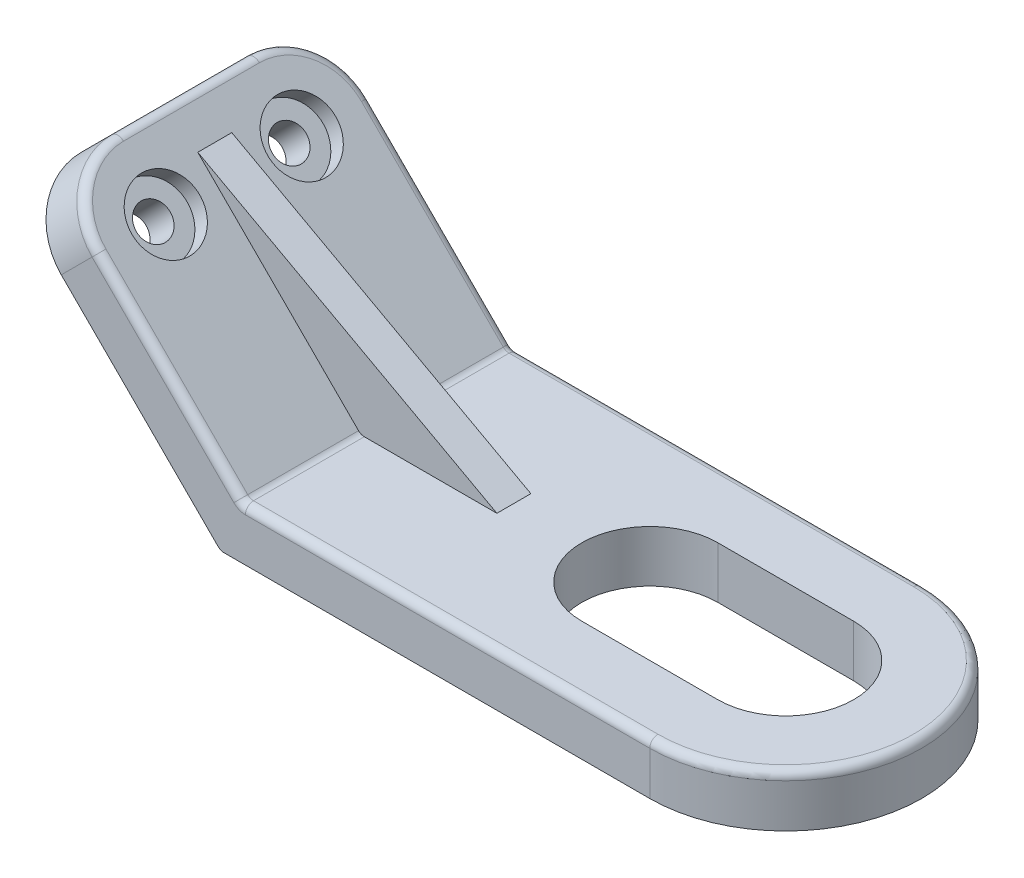
ISO-10303-21;
HEADER;
FILE_DESCRIPTION(('STEP AP214'),'2;1');
FILE_NAME('part.step','',(''),(''),'','','');
FILE_SCHEMA(('AUTOMOTIVE_DESIGN { 1 0 10303 214 1 1 1 1 }'));
ENDSEC;
DATA;
#1=APPLICATION_CONTEXT('core data for automotive mechanical design processes');
#2=APPLICATION_PROTOCOL_DEFINITION('international standard','automotive_design',2000,#1);
#3=PRODUCT_CONTEXT('',#1,'mechanical');
#4=PRODUCT('Part','Part','',(#3));
#5=PRODUCT_RELATED_PRODUCT_CATEGORY('part','',(#4));
#6=PRODUCT_DEFINITION_FORMATION('','',#4);
#7=PRODUCT_DEFINITION_CONTEXT('part definition',#1,'design');
#8=PRODUCT_DEFINITION('design','',#6,#7);
#9=PRODUCT_DEFINITION_SHAPE('','',#8);
#10=(LENGTH_UNIT() NAMED_UNIT(*) SI_UNIT(.MILLI.,.METRE.));
#11=(NAMED_UNIT(*) PLANE_ANGLE_UNIT() SI_UNIT($,.RADIAN.));
#12=(NAMED_UNIT(*) SI_UNIT($,.STERADIAN.) SOLID_ANGLE_UNIT());
#13=UNCERTAINTY_MEASURE_WITH_UNIT(LENGTH_MEASURE(1.E-05),#10,'distance_accuracy_value','');
#14=(GEOMETRIC_REPRESENTATION_CONTEXT(3) GLOBAL_UNCERTAINTY_ASSIGNED_CONTEXT((#13)) GLOBAL_UNIT_ASSIGNED_CONTEXT((#10,
#11,#12)) REPRESENTATION_CONTEXT('',''));
#15=CARTESIAN_POINT('',(0.,0.,0.));
#16=DIRECTION('',(0.,0.,1.));
#17=DIRECTION('',(1.,0.,0.));
#18=AXIS2_PLACEMENT_3D('',#15,#16,#17);
#19=CARTESIAN_POINT('',(76.2,-9.65200000000001,0.));
#20=DIRECTION('',(0.,-1.,0.));
#21=DIRECTION('',(0.,0.,-1.));
#22=AXIS2_PLACEMENT_3D('',#19,#20,#21);
#23=CYLINDRICAL_SURFACE('',#22,25.4);
#24=DIRECTION('',(0.,-1.,0.));
#25=VECTOR('',#24,1.);
#26=CARTESIAN_POINT('',(76.2,0.,-25.4));
#27=LINE('',#26,#25);
#28=CARTESIAN_POINT('',(76.2,-1.524,-25.4));
#29=VERTEX_POINT('',#28);
#30=CARTESIAN_POINT('',(76.2,-9.65200000000001,-25.4));
#31=VERTEX_POINT('',#30);
#32=EDGE_CURVE('E341',#29,#31,#27,.T.);
#33=ORIENTED_EDGE('',*,*,#32,.F.);
#34=CARTESIAN_POINT('',(76.2,-1.524,0.));
#35=DIRECTION('',(0.,-1.,0.));
#36=DIRECTION('',(0.,0.,-1.));
#37=AXIS2_PLACEMENT_3D('',#34,#35,#36);
#38=CIRCLE('',#37,25.4);
#39=CARTESIAN_POINT('',(76.2,-1.524,25.4));
#40=VERTEX_POINT('',#39);
#41=EDGE_CURVE('E370',#29,#40,#38,.T.);
#42=ORIENTED_EDGE('',*,*,#41,.T.);
#43=DIRECTION('',(0.,1.,0.));
#44=VECTOR('',#43,1.);
#45=CARTESIAN_POINT('',(76.2,-9.65200000000002,25.4));
#46=LINE('',#45,#44);
#47=CARTESIAN_POINT('',(76.2,-9.65200000000002,25.4));
#48=VERTEX_POINT('',#47);
#49=EDGE_CURVE('E337',#48,#40,#46,.T.);
#50=ORIENTED_EDGE('',*,*,#49,.F.);
#51=CARTESIAN_POINT('',(76.2,-9.65200000000001,0.));
#52=DIRECTION('',(0.,-1.,0.));
#53=DIRECTION('',(0.,0.,-1.));
#54=AXIS2_PLACEMENT_3D('',#51,#52,#53);
#55=CIRCLE('',#54,25.4);
#56=EDGE_CURVE('E344',#31,#48,#55,.T.);
#57=ORIENTED_EDGE('',*,*,#56,.F.);
#58=EDGE_LOOP('',(#33,#42,#50,#57));
#59=FACE_BOUND('',#58,.T.);
#60=ADVANCED_FACE('F43',(#59),#23,.T.);
#61=CARTESIAN_POINT('',(0.,0.,25.4));
#62=DIRECTION('',(-0.707106781186544,-0.707106781186551,0.));
#63=DIRECTION('',(0.707106781186551,-0.707106781186544,0.));
#64=AXIS2_PLACEMENT_3D('',#61,#62,#63);
#65=PLANE('',#64);
#66=CARTESIAN_POINT('',(-26.9407683632076,26.9407683632073,-12.7));
#67=DIRECTION('',(0.707106781186544,0.707106781186551,0.));
#68=DIRECTION('',(-0.707106781186551,0.707106781186544,0.));
#69=AXIS2_PLACEMENT_3D('',#66,#67,#68);
#70=CIRCLE('',#69,6.35);
#71=CARTESIAN_POINT('',(-31.4308964237422,31.4308964237419,-12.7));
#72=VERTEX_POINT('',#71);
#73=EDGE_CURVE('E479',#72,#72,#70,.T.);
#74=ORIENTED_EDGE('',*,*,#73,.F.);
#75=EDGE_LOOP('',(#74));
#76=FACE_BOUND('',#75,.T.);
#77=CARTESIAN_POINT('',(-26.9407683632076,26.9407683632073,12.7));
#78=DIRECTION('',(0.707106781186544,0.707106781186551,0.));
#79=DIRECTION('',(-0.707106781186551,0.707106781186544,0.));
#80=AXIS2_PLACEMENT_3D('',#77,#78,#79);
#81=CIRCLE('',#80,6.35);
#82=CARTESIAN_POINT('',(-31.4308964237422,31.4308964237419,12.7));
#83=VERTEX_POINT('',#82);
#84=EDGE_CURVE('E282',#83,#83,#81,.T.);
#85=ORIENTED_EDGE('',*,*,#84,.F.);
#86=EDGE_LOOP('',(#85));
#87=FACE_BOUND('',#86,.T.);
#88=DIRECTION('',(0.,0.,-1.));
#89=VECTOR('',#88,1.);
#90=CARTESIAN_POINT('',(-0.446369265471702,0.446369265471694,-25.4));
#91=LINE('',#90,#89);
#92=CARTESIAN_POINT('',(-0.446369265471699,0.446369265471697,-3.175));
#93=VERTEX_POINT('',#92);
#94=CARTESIAN_POINT('',(-0.446369265471702,0.446369265471694,-23.876));
#95=VERTEX_POINT('',#94);
#96=EDGE_CURVE('E320',#93,#95,#91,.T.);
#97=ORIENTED_EDGE('',*,*,#96,.T.);
#98=DIRECTION('',(-0.707106781186551,0.707106781186544,0.));
#99=VECTOR('',#98,1.);
#100=CARTESIAN_POINT('',(-26.9407683632076,26.9407683632073,-23.876));
#101=LINE('',#100,#99);
#102=CARTESIAN_POINT('',(-26.9407683632076,26.9407683632073,-23.876));
#103=VERTEX_POINT('',#102);
#104=EDGE_CURVE('E397',#95,#103,#101,.T.);
#105=ORIENTED_EDGE('',*,*,#104,.T.);
#106=CARTESIAN_POINT('',(-26.9407683632076,26.9407683632073,-12.7));
#107=DIRECTION('',(-0.707106781186544,-0.707106781186551,0.));
#108=DIRECTION('',(0.707106781186551,-0.707106781186544,0.));
#109=AXIS2_PLACEMENT_3D('',#106,#107,#108);
#110=CIRCLE('',#109,11.176);
#111=CARTESIAN_POINT('',(-34.8433937497485,34.8433937497481,-12.7));
#112=VERTEX_POINT('',#111);
#113=EDGE_CURVE('E394',#103,#112,#110,.F.);
#114=ORIENTED_EDGE('',*,*,#113,.T.);
#115=DIRECTION('',(0.,0.,-1.));
#116=VECTOR('',#115,1.);
#117=CARTESIAN_POINT('',(-34.8433937497485,34.8433937497481,12.7));
#118=LINE('',#117,#116);
#119=CARTESIAN_POINT('',(-34.8433937497485,34.8433937497481,12.7));
#120=VERTEX_POINT('',#119);
#121=EDGE_CURVE('E391',#112,#120,#118,.F.);
#122=ORIENTED_EDGE('',*,*,#121,.T.);
#123=CARTESIAN_POINT('',(-26.9407683632076,26.9407683632073,12.7));
#124=DIRECTION('',(-0.707106781186544,-0.707106781186551,0.));
#125=DIRECTION('',(0.707106781186551,-0.707106781186544,0.));
#126=AXIS2_PLACEMENT_3D('',#123,#124,#125);
#127=CIRCLE('',#126,11.176);
#128=CARTESIAN_POINT('',(-26.9407683632076,26.9407683632073,23.876));
#129=VERTEX_POINT('',#128);
#130=EDGE_CURVE('E388',#120,#129,#127,.F.);
#131=ORIENTED_EDGE('',*,*,#130,.T.);
#132=DIRECTION('',(-0.707106781186551,0.707106781186544,0.));
#133=VECTOR('',#132,1.);
#134=CARTESIAN_POINT('',(0.,0.,23.876));
#135=LINE('',#134,#133);
#136=CARTESIAN_POINT('',(-0.446369265471699,0.446369265471694,23.876));
#137=VERTEX_POINT('',#136);
#138=EDGE_CURVE('E385',#129,#137,#135,.F.);
#139=ORIENTED_EDGE('',*,*,#138,.T.);
#140=DIRECTION('',(0.,0.,-1.));
#141=VECTOR('',#140,1.);
#142=CARTESIAN_POINT('',(-0.446369265471699,0.446369265471697,3.175));
#143=LINE('',#142,#141);
#144=CARTESIAN_POINT('',(-0.446369265471699,0.446369265471697,3.175));
#145=VERTEX_POINT('',#144);
#146=EDGE_CURVE('E317',#137,#145,#143,.T.);
#147=ORIENTED_EDGE('',*,*,#146,.T.);
#148=DIRECTION('',(-0.707106781186551,0.707106781186544,0.));
#149=VECTOR('',#148,1.);
#150=CARTESIAN_POINT('',(0.,0.,3.175));
#151=LINE('',#150,#149);
#152=CARTESIAN_POINT('',(-30.4800000000007,30.4800000000004,3.175));
#153=VERTEX_POINT('',#152);
#154=EDGE_CURVE('E469',#145,#153,#151,.T.);
#155=ORIENTED_EDGE('',*,*,#154,.T.);
#156=DIRECTION('',(0.,0.,1.));
#157=VECTOR('',#156,1.);
#158=CARTESIAN_POINT('',(-30.4800000000007,30.4800000000004,25.4));
#159=LINE('',#158,#157);
#160=CARTESIAN_POINT('',(-30.4800000000008,30.4800000000005,-3.175));
#161=VERTEX_POINT('',#160);
#162=EDGE_CURVE('E475',#153,#161,#159,.F.);
#163=ORIENTED_EDGE('',*,*,#162,.T.);
#164=DIRECTION('',(-0.707106781186551,0.707106781186544,0.));
#165=VECTOR('',#164,1.);
#166=CARTESIAN_POINT('',(0.,0.,-3.175));
#167=LINE('',#166,#165);
#168=EDGE_CURVE('E462',#93,#161,#167,.T.);
#169=ORIENTED_EDGE('',*,*,#168,.F.);
#170=EDGE_LOOP('',(#97,#105,#114,#122,#131,#139,#147,#155,#163,#169));
#171=FACE_BOUND('',#170,.T.);
#172=ADVANCED_FACE('F515',(#76,#87,#171),#65,.F.);
#173=CARTESIAN_POINT('',(-42.7460191362893,29.0960298322638,25.4));
#174=DIRECTION('',(-0.707106781186551,0.707106781186545,0.));
#175=DIRECTION('',(-0.707106781186545,-0.707106781186551,0.));
#176=AXIS2_PLACEMENT_3D('',#173,#174,#175);
#177=PLANE('',#176);
#178=DIRECTION('',(0.707106781186545,0.707106781186551,0.));
#179=VECTOR('',#178,1.);
#180=CARTESIAN_POINT('',(-35.9210244842768,35.9210244842764,12.7));
#181=LINE('',#180,#179);
#182=CARTESIAN_POINT('',(-42.7460191362893,29.0960298322638,12.7));
#183=VERTEX_POINT('',#182);
#184=CARTESIAN_POINT('',(-36.9986552188051,34.8433937497481,12.7));
#185=VERTEX_POINT('',#184);
#186=EDGE_CURVE('E287',#183,#185,#181,.T.);
#187=ORIENTED_EDGE('',*,*,#186,.T.);
#188=DIRECTION('',(0.,0.,-1.));
#189=VECTOR('',#188,1.);
#190=CARTESIAN_POINT('',(-36.9986552188051,34.8433937497481,-12.7));
#191=LINE('',#190,#189);
#192=CARTESIAN_POINT('',(-36.9986552188051,34.8433937497481,-12.7));
#193=VERTEX_POINT('',#192);
#194=EDGE_CURVE('E53',#185,#193,#191,.T.);
#195=ORIENTED_EDGE('',*,*,#194,.T.);
#196=DIRECTION('',(0.707106781186545,0.707106781186551,0.));
#197=VECTOR('',#196,1.);
#198=CARTESIAN_POINT('',(-42.7460191362893,29.0960298322638,-12.7));
#199=LINE('',#198,#197);
#200=CARTESIAN_POINT('',(-42.7460191362893,29.0960298322638,-12.7));
#201=VERTEX_POINT('',#200);
#202=EDGE_CURVE('E290',#193,#201,#199,.F.);
#203=ORIENTED_EDGE('',*,*,#202,.T.);
#204=DIRECTION('',(0.,0.,-1.));
#205=VECTOR('',#204,1.);
#206=CARTESIAN_POINT('',(-42.7460191362893,29.0960298322638,25.4));
#207=LINE('',#206,#205);
#208=EDGE_CURVE('E265',#183,#201,#207,.T.);
#209=ORIENTED_EDGE('',*,*,#208,.F.);
#210=EDGE_LOOP('',(#187,#195,#203,#209));
#211=FACE_BOUND('',#210,.T.);
#212=ADVANCED_FACE('F518',(#211),#177,.T.);
#213=CARTESIAN_POINT('',(-6.82499465201253,-6.8249946520126,25.4));
#214=DIRECTION('',(-0.707106781186544,-0.707106781186551,0.));
#215=DIRECTION('',(0.707106781186551,-0.707106781186544,0.));
#216=AXIS2_PLACEMENT_3D('',#213,#214,#215);
#217=PLANE('',#216);
#218=DIRECTION('',(-0.707106781186551,0.707106781186544,0.));
#219=VECTOR('',#218,1.);
#220=CARTESIAN_POINT('',(-6.82499465201251,-6.8249946520126,-25.4));
#221=LINE('',#220,#219);
#222=CARTESIAN_POINT('',(-4.44435856949678,-9.20563073452831,-25.4));
#223=VERTEX_POINT('',#222);
#224=CARTESIAN_POINT('',(-33.7657630152202,20.1157737111947,-25.4));
#225=VERTEX_POINT('',#224);
#226=EDGE_CURVE('E251',#223,#225,#221,.T.);
#227=ORIENTED_EDGE('',*,*,#226,.F.);
#228=DIRECTION('',(0.,0.,-1.));
#229=VECTOR('',#228,1.);
#230=CARTESIAN_POINT('',(-4.44435856949678,-9.20563073452831,25.4));
#231=LINE('',#230,#229);
#232=CARTESIAN_POINT('',(-4.44435856949678,-9.20563073452831,25.4));
#233=VERTEX_POINT('',#232);
#234=EDGE_CURVE('E310',#223,#233,#231,.F.);
#235=ORIENTED_EDGE('',*,*,#234,.T.);
#236=DIRECTION('',(-0.707106781186551,0.707106781186544,0.));
#237=VECTOR('',#236,1.);
#238=CARTESIAN_POINT('',(-6.82499465201253,-6.8249946520126,25.4));
#239=LINE('',#238,#237);
#240=CARTESIAN_POINT('',(-33.7657630152202,20.1157737111947,25.4));
#241=VERTEX_POINT('',#240);
#242=EDGE_CURVE('E257',#233,#241,#239,.T.);
#243=ORIENTED_EDGE('',*,*,#242,.T.);
#244=CARTESIAN_POINT('',(-33.7657630152202,20.1157737111947,12.7));
#245=DIRECTION('',(-0.707106781186544,-0.707106781186551,0.));
#246=DIRECTION('',(0.707106781186551,-0.707106781186544,0.));
#247=AXIS2_PLACEMENT_3D('',#244,#245,#246);
#248=CIRCLE('',#247,12.7);
#249=EDGE_CURVE('E293',#241,#183,#248,.T.);
#250=ORIENTED_EDGE('',*,*,#249,.T.);
#251=ORIENTED_EDGE('',*,*,#208,.T.);
#252=CARTESIAN_POINT('',(-33.7657630152201,20.1157737111947,-12.7));
#253=DIRECTION('',(-0.707106781186544,-0.707106781186551,0.));
#254=DIRECTION('',(0.707106781186551,-0.707106781186544,0.));
#255=AXIS2_PLACEMENT_3D('',#252,#253,#254);
#256=CIRCLE('',#255,12.7);
#257=EDGE_CURVE('E296',#201,#225,#256,.T.);
#258=ORIENTED_EDGE('',*,*,#257,.T.);
#259=EDGE_LOOP('',(#227,#235,#243,#250,#251,#258));
#260=FACE_BOUND('',#259,.T.);
#261=CARTESIAN_POINT('',(-33.7657630152201,20.1157737111947,12.7));
#262=DIRECTION('',(-0.707106781186544,-0.707106781186551,0.));
#263=DIRECTION('',(0.707106781186551,-0.707106781186544,0.));
#264=AXIS2_PLACEMENT_3D('',#261,#262,#263);
#265=CIRCLE('',#264,3.175);
#266=CARTESIAN_POINT('',(-31.5206989849528,17.8707096809274,12.7));
#267=VERTEX_POINT('',#266);
#268=EDGE_CURVE('E238',#267,#267,#265,.T.);
#269=ORIENTED_EDGE('',*,*,#268,.F.);
#270=EDGE_LOOP('',(#269));
#271=FACE_BOUND('',#270,.T.);
#272=CARTESIAN_POINT('',(-33.7657630152201,20.1157737111947,-12.7));
#273=DIRECTION('',(-0.707106781186544,-0.707106781186551,0.));
#274=DIRECTION('',(0.707106781186551,-0.707106781186544,0.));
#275=AXIS2_PLACEMENT_3D('',#272,#273,#274);
#276=CIRCLE('',#275,3.17499999999999);
#277=CARTESIAN_POINT('',(-31.5206989849528,17.8707096809274,-12.7));
#278=VERTEX_POINT('',#277);
#279=EDGE_CURVE('E278',#278,#278,#276,.T.);
#280=ORIENTED_EDGE('',*,*,#279,.F.);
#281=EDGE_LOOP('',(#280));
#282=FACE_BOUND('',#281,.T.);
#283=ADVANCED_FACE('F584',(#260,#271,#282),#217,.T.);
#284=CARTESIAN_POINT('',(0.,-9.652,25.4));
#285=DIRECTION('',(0.,-1.,0.));
#286=DIRECTION('',(0.,0.,-1.));
#287=AXIS2_PLACEMENT_3D('',#284,#285,#286);
#288=PLANE('',#287);
#289=DIRECTION('',(1.,0.,0.));
#290=VECTOR('',#289,1.);
#291=CARTESIAN_POINT('',(0.,-9.652,-25.4));
#292=LINE('',#291,#290);
#293=CARTESIAN_POINT('',(-3.36672783496848,-9.65200000000001,-25.4));
#294=VERTEX_POINT('',#293);
#295=EDGE_CURVE('E262',#31,#294,#292,.F.);
#296=ORIENTED_EDGE('',*,*,#295,.F.);
#297=ORIENTED_EDGE('',*,*,#56,.T.);
#298=DIRECTION('',(1.,0.,0.));
#299=VECTOR('',#298,1.);
#300=CARTESIAN_POINT('',(0.,-9.652,25.4));
#301=LINE('',#300,#299);
#302=CARTESIAN_POINT('',(-3.3667278349685,-9.65200000000001,25.4));
#303=VERTEX_POINT('',#302);
#304=EDGE_CURVE('E261',#48,#303,#301,.F.);
#305=ORIENTED_EDGE('',*,*,#304,.T.);
#306=DIRECTION('',(0.,0.,-1.));
#307=VECTOR('',#306,1.);
#308=CARTESIAN_POINT('',(-3.3667278349685,-9.65200000000001,25.4));
#309=LINE('',#308,#307);
#310=EDGE_CURVE('E303',#303,#294,#309,.T.);
#311=ORIENTED_EDGE('',*,*,#310,.T.);
#312=EDGE_LOOP('',(#296,#297,#305,#311));
#313=FACE_BOUND('',#312,.T.);
#314=CARTESIAN_POINT('',(50.8,-9.652,0.));
#315=DIRECTION('',(0.,1.,0.));
#316=DIRECTION('',(0.,0.,1.));
#317=AXIS2_PLACEMENT_3D('',#314,#315,#316);
#318=CIRCLE('',#317,12.7);
#319=CARTESIAN_POINT('',(50.8,-9.652,-12.7));
#320=VERTEX_POINT('',#319);
#321=CARTESIAN_POINT('',(50.8,-9.652,12.7));
#322=VERTEX_POINT('',#321);
#323=EDGE_CURVE('E201',#320,#322,#318,.T.);
#324=ORIENTED_EDGE('',*,*,#323,.T.);
#325=DIRECTION('',(1.,0.,0.));
#326=VECTOR('',#325,1.);
#327=CARTESIAN_POINT('',(50.8,-9.652,12.7));
#328=LINE('',#327,#326);
#329=CARTESIAN_POINT('',(76.2,-9.65200000000002,12.7));
#330=VERTEX_POINT('',#329);
#331=EDGE_CURVE('E206',#322,#330,#328,.T.);
#332=ORIENTED_EDGE('',*,*,#331,.T.);
#333=CARTESIAN_POINT('',(76.2,-9.65200000000001,0.));
#334=DIRECTION('',(0.,1.,0.));
#335=DIRECTION('',(0.,0.,1.));
#336=AXIS2_PLACEMENT_3D('',#333,#334,#335);
#337=CIRCLE('',#336,12.7);
#338=CARTESIAN_POINT('',(76.2,-9.65200000000001,-12.7));
#339=VERTEX_POINT('',#338);
#340=EDGE_CURVE('E227',#330,#339,#337,.T.);
#341=ORIENTED_EDGE('',*,*,#340,.T.);
#342=DIRECTION('',(-1.,0.,0.));
#343=VECTOR('',#342,1.);
#344=CARTESIAN_POINT('',(50.8,-9.652,-12.7));
#345=LINE('',#344,#343);
#346=EDGE_CURVE('E208',#339,#320,#345,.T.);
#347=ORIENTED_EDGE('',*,*,#346,.T.);
#348=EDGE_LOOP('',(#324,#332,#341,#347));
#349=FACE_BOUND('',#348,.T.);
#350=ADVANCED_FACE('F203',(#313,#349),#288,.T.);
#351=CARTESIAN_POINT('',(0.,0.,25.4));
#352=DIRECTION('',(0.,-1.,0.));
#353=DIRECTION('',(0.,0.,-1.));
#354=AXIS2_PLACEMENT_3D('',#351,#352,#353);
#355=PLANE('',#354);
#356=DIRECTION('',(1.,0.,0.));
#357=VECTOR('',#356,1.);
#358=CARTESIAN_POINT('',(50.8,0.,12.7));
#359=LINE('',#358,#357);
#360=CARTESIAN_POINT('',(50.8,0.,12.7));
#361=VERTEX_POINT('',#360);
#362=CARTESIAN_POINT('',(76.2,0.,12.7));
#363=VERTEX_POINT('',#362);
#364=EDGE_CURVE('E237',#361,#363,#359,.T.);
#365=ORIENTED_EDGE('',*,*,#364,.F.);
#366=CARTESIAN_POINT('',(50.8,0.,0.));
#367=DIRECTION('',(0.,1.,0.));
#368=DIRECTION('',(0.,0.,1.));
#369=AXIS2_PLACEMENT_3D('',#366,#367,#368);
#370=CIRCLE('',#369,12.7);
#371=CARTESIAN_POINT('',(50.8,0.,-12.7));
#372=VERTEX_POINT('',#371);
#373=EDGE_CURVE('E217',#372,#361,#370,.T.);
#374=ORIENTED_EDGE('',*,*,#373,.F.);
#375=DIRECTION('',(-1.,0.,0.));
#376=VECTOR('',#375,1.);
#377=CARTESIAN_POINT('',(50.8,0.,-12.7));
#378=LINE('',#377,#376);
#379=CARTESIAN_POINT('',(76.2,0.,-12.7));
#380=VERTEX_POINT('',#379);
#381=EDGE_CURVE('E211',#380,#372,#378,.T.);
#382=ORIENTED_EDGE('',*,*,#381,.F.);
#383=CARTESIAN_POINT('',(76.2,0.,0.));
#384=DIRECTION('',(0.,1.,0.));
#385=DIRECTION('',(0.,0.,1.));
#386=AXIS2_PLACEMENT_3D('',#383,#384,#385);
#387=CIRCLE('',#386,12.7);
#388=EDGE_CURVE('E241',#363,#380,#387,.T.);
#389=ORIENTED_EDGE('',*,*,#388,.F.);
#390=EDGE_LOOP('',(#365,#374,#382,#389));
#391=FACE_BOUND('',#390,.T.);
#392=DIRECTION('',(0.,0.,-1.));
#393=VECTOR('',#392,1.);
#394=CARTESIAN_POINT('',(0.631261469056593,0.,25.4));
#395=LINE('',#394,#393);
#396=CARTESIAN_POINT('',(0.63126146905659,0.,3.175));
#397=VERTEX_POINT('',#396);
#398=CARTESIAN_POINT('',(0.631261469056593,0.,23.876));
#399=VERTEX_POINT('',#398);
#400=EDGE_CURVE('E324',#397,#399,#395,.F.);
#401=ORIENTED_EDGE('',*,*,#400,.T.);
#402=DIRECTION('',(-1.,0.,0.));
#403=VECTOR('',#402,1.);
#404=CARTESIAN_POINT('',(0.,0.,23.876));
#405=LINE('',#404,#403);
#406=CARTESIAN_POINT('',(76.2,0.,23.876));
#407=VERTEX_POINT('',#406);
#408=EDGE_CURVE('E367',#399,#407,#405,.F.);
#409=ORIENTED_EDGE('',*,*,#408,.T.);
#410=CARTESIAN_POINT('',(76.2,0.,0.));
#411=DIRECTION('',(0.,-1.,0.));
#412=DIRECTION('',(0.,0.,-1.));
#413=AXIS2_PLACEMENT_3D('',#410,#411,#412);
#414=CIRCLE('',#413,23.876);
#415=CARTESIAN_POINT('',(76.2,0.,-23.876));
#416=VERTEX_POINT('',#415);
#417=EDGE_CURVE('E364',#407,#416,#414,.F.);
#418=ORIENTED_EDGE('',*,*,#417,.T.);
#419=DIRECTION('',(-1.,0.,0.));
#420=VECTOR('',#419,1.);
#421=CARTESIAN_POINT('',(0.631261469056593,0.,-23.876));
#422=LINE('',#421,#420);
#423=CARTESIAN_POINT('',(0.631261469056593,0.,-23.876));
#424=VERTEX_POINT('',#423);
#425=EDGE_CURVE('E361',#416,#424,#422,.T.);
#426=ORIENTED_EDGE('',*,*,#425,.T.);
#427=DIRECTION('',(0.,0.,-1.));
#428=VECTOR('',#427,1.);
#429=CARTESIAN_POINT('',(0.63126146905659,0.,-3.175));
#430=LINE('',#429,#428);
#431=CARTESIAN_POINT('',(0.63126146905659,0.,-3.175));
#432=VERTEX_POINT('',#431);
#433=EDGE_CURVE('E328',#424,#432,#430,.F.);
#434=ORIENTED_EDGE('',*,*,#433,.T.);
#435=DIRECTION('',(-1.,0.,0.));
#436=VECTOR('',#435,1.);
#437=CARTESIAN_POINT('',(0.,0.,-3.175));
#438=LINE('',#437,#436);
#439=CARTESIAN_POINT('',(25.4,0.,-3.175));
#440=VERTEX_POINT('',#439);
#441=EDGE_CURVE('E457',#440,#432,#438,.T.);
#442=ORIENTED_EDGE('',*,*,#441,.F.);
#443=DIRECTION('',(0.,0.,-1.));
#444=VECTOR('',#443,1.);
#445=CARTESIAN_POINT('',(25.4,0.,25.4));
#446=LINE('',#445,#444);
#447=CARTESIAN_POINT('',(25.4,0.,3.175));
#448=VERTEX_POINT('',#447);
#449=EDGE_CURVE('E472',#440,#448,#446,.F.);
#450=ORIENTED_EDGE('',*,*,#449,.T.);
#451=DIRECTION('',(-1.,0.,0.));
#452=VECTOR('',#451,1.);
#453=CARTESIAN_POINT('',(0.,0.,3.175));
#454=LINE('',#453,#452);
#455=EDGE_CURVE('E465',#448,#397,#454,.T.);
#456=ORIENTED_EDGE('',*,*,#455,.T.);
#457=EDGE_LOOP('',(#401,#409,#418,#426,#434,#442,#450,#456));
#458=FACE_BOUND('',#457,.T.);
#459=ADVANCED_FACE('F561',(#391,#458),#355,.F.);
#460=CARTESIAN_POINT('',(0.,0.,25.4));
#461=DIRECTION('',(0.,0.,-1.));
#462=DIRECTION('',(-1.,0.,0.));
#463=AXIS2_PLACEMENT_3D('',#460,#461,#462);
#464=PLANE('',#463);
#465=ORIENTED_EDGE('',*,*,#49,.T.);
#466=DIRECTION('',(-1.,0.,0.));
#467=VECTOR('',#466,1.);
#468=CARTESIAN_POINT('',(0.,-1.524,25.4));
#469=LINE('',#468,#467);
#470=CARTESIAN_POINT('',(0.63126146905659,-1.524,25.4));
#471=VERTEX_POINT('',#470);
#472=EDGE_CURVE('E354',#40,#471,#469,.T.);
#473=ORIENTED_EDGE('',*,*,#472,.T.);
#474=CARTESIAN_POINT('',(0.631261469056593,1.524,25.4));
#475=DIRECTION('',(0.,0.,-1.));
#476=DIRECTION('',(-1.,0.,0.));
#477=AXIS2_PLACEMENT_3D('',#474,#475,#476);
#478=CIRCLE('',#477,3.048);
#479=CARTESIAN_POINT('',(-1.52399999999999,-0.631261469056609,25.4));
#480=VERTEX_POINT('',#479);
#481=EDGE_CURVE('E350',#471,#480,#478,.T.);
#482=ORIENTED_EDGE('',*,*,#481,.T.);
#483=DIRECTION('',(-0.707106781186551,0.707106781186544,0.));
#484=VECTOR('',#483,1.);
#485=CARTESIAN_POINT('',(-1.07763073452829,-1.0776307345283,25.4));
#486=LINE('',#485,#484);
#487=CARTESIAN_POINT('',(-28.0183990977359,25.863137628679,25.4));
#488=VERTEX_POINT('',#487);
#489=EDGE_CURVE('E347',#480,#488,#486,.T.);
#490=ORIENTED_EDGE('',*,*,#489,.T.);
#491=DIRECTION('',(0.707106781186545,0.707106781186551,0.));
#492=VECTOR('',#491,1.);
#493=CARTESIAN_POINT('',(-33.7657630152202,20.1157737111947,25.4));
#494=LINE('',#493,#492);
#495=EDGE_CURVE('E300',#488,#241,#494,.F.);
#496=ORIENTED_EDGE('',*,*,#495,.T.);
#497=ORIENTED_EDGE('',*,*,#242,.F.);
#498=CARTESIAN_POINT('',(-3.36672783496848,-8.128,25.4));
#499=DIRECTION('',(0.,0.,-1.));
#500=DIRECTION('',(-1.,0.,0.));
#501=AXIS2_PLACEMENT_3D('',#498,#499,#500);
#502=CIRCLE('',#501,1.524);
#503=EDGE_CURVE('E313',#233,#303,#502,.F.);
#504=ORIENTED_EDGE('',*,*,#503,.T.);
#505=ORIENTED_EDGE('',*,*,#304,.F.);
#506=EDGE_LOOP('',(#465,#473,#482,#490,#496,#497,#504,#505));
#507=FACE_BOUND('',#506,.T.);
#508=ADVANCED_FACE('F590',(#507),#464,.F.);
#509=CARTESIAN_POINT('',(0.,0.,-25.4));
#510=DIRECTION('',(0.,0.,-1.));
#511=DIRECTION('',(-1.,0.,0.));
#512=AXIS2_PLACEMENT_3D('',#509,#510,#511);
#513=PLANE('',#512);
#514=CARTESIAN_POINT('',(0.63126146905659,1.524,-25.4));
#515=DIRECTION('',(0.,0.,-1.));
#516=DIRECTION('',(-1.,0.,0.));
#517=AXIS2_PLACEMENT_3D('',#514,#515,#516);
#518=CIRCLE('',#517,3.048);
#519=CARTESIAN_POINT('',(-1.52399999999999,-0.631261469056612,-25.4));
#520=VERTEX_POINT('',#519);
#521=CARTESIAN_POINT('',(0.631261469056593,-1.524,-25.4));
#522=VERTEX_POINT('',#521);
#523=EDGE_CURVE('E376',#520,#522,#518,.F.);
#524=ORIENTED_EDGE('',*,*,#523,.T.);
#525=DIRECTION('',(-1.,0.,0.));
#526=VECTOR('',#525,1.);
#527=CARTESIAN_POINT('',(76.2,-1.524,-25.4));
#528=LINE('',#527,#526);
#529=EDGE_CURVE('E379',#522,#29,#528,.F.);
#530=ORIENTED_EDGE('',*,*,#529,.T.);
#531=ORIENTED_EDGE('',*,*,#32,.T.);
#532=ORIENTED_EDGE('',*,*,#295,.T.);
#533=CARTESIAN_POINT('',(-3.3667278349685,-8.128,-25.4));
#534=DIRECTION('',(0.,0.,-1.));
#535=DIRECTION('',(-1.,0.,0.));
#536=AXIS2_PLACEMENT_3D('',#533,#534,#535);
#537=CIRCLE('',#536,1.524);
#538=EDGE_CURVE('E307',#294,#223,#537,.T.);
#539=ORIENTED_EDGE('',*,*,#538,.T.);
#540=ORIENTED_EDGE('',*,*,#226,.T.);
#541=DIRECTION('',(0.707106781186545,0.707106781186551,0.));
#542=VECTOR('',#541,1.);
#543=CARTESIAN_POINT('',(-26.9407683632076,26.9407683632073,-25.4));
#544=LINE('',#543,#542);
#545=CARTESIAN_POINT('',(-28.0183990977359,25.863137628679,-25.4));
#546=VERTEX_POINT('',#545);
#547=EDGE_CURVE('E273',#225,#546,#544,.T.);
#548=ORIENTED_EDGE('',*,*,#547,.T.);
#549=DIRECTION('',(-0.707106781186551,0.707106781186544,0.));
#550=VECTOR('',#549,1.);
#551=CARTESIAN_POINT('',(-1.52399999999999,-0.631261469056612,-25.4));
#552=LINE('',#551,#550);
#553=EDGE_CURVE('E373',#546,#520,#552,.F.);
#554=ORIENTED_EDGE('',*,*,#553,.T.);
#555=EDGE_LOOP('',(#524,#530,#531,#532,#539,#540,#548,#554));
#556=FACE_BOUND('',#555,.T.);
#557=ADVANCED_FACE('F575',(#556),#513,.T.);
#558=CARTESIAN_POINT('',(50.8,-9.652,0.));
#559=DIRECTION('',(0.,1.,0.));
#560=DIRECTION('',(0.,0.,1.));
#561=AXIS2_PLACEMENT_3D('',#558,#559,#560);
#562=CYLINDRICAL_SURFACE('',#561,12.7);
#563=DIRECTION('',(0.,1.,0.));
#564=VECTOR('',#563,1.);
#565=CARTESIAN_POINT('',(50.8,-9.652,12.7));
#566=LINE('',#565,#564);
#567=EDGE_CURVE('E214',#322,#361,#566,.T.);
#568=ORIENTED_EDGE('',*,*,#567,.F.);
#569=ORIENTED_EDGE('',*,*,#323,.F.);
#570=DIRECTION('',(0.,1.,0.));
#571=VECTOR('',#570,1.);
#572=CARTESIAN_POINT('',(50.8,-9.652,-12.7));
#573=LINE('',#572,#571);
#574=EDGE_CURVE('E248',#320,#372,#573,.T.);
#575=ORIENTED_EDGE('',*,*,#574,.T.);
#576=ORIENTED_EDGE('',*,*,#373,.T.);
#577=EDGE_LOOP('',(#568,#569,#575,#576));
#578=FACE_BOUND('',#577,.T.);
#579=ADVANCED_FACE('F215',(#578),#562,.F.);
#580=CARTESIAN_POINT('',(50.8,-9.652,-12.7));
#581=DIRECTION('',(0.,0.,-1.));
#582=DIRECTION('',(-1.,0.,0.));
#583=AXIS2_PLACEMENT_3D('',#580,#581,#582);
#584=PLANE('',#583);
#585=ORIENTED_EDGE('',*,*,#381,.T.);
#586=ORIENTED_EDGE('',*,*,#574,.F.);
#587=ORIENTED_EDGE('',*,*,#346,.F.);
#588=DIRECTION('',(0.,1.,0.));
#589=VECTOR('',#588,1.);
#590=CARTESIAN_POINT('',(76.2,-9.65200000000001,-12.7));
#591=LINE('',#590,#589);
#592=EDGE_CURVE('E252',#339,#380,#591,.T.);
#593=ORIENTED_EDGE('',*,*,#592,.T.);
#594=EDGE_LOOP('',(#585,#586,#587,#593));
#595=FACE_BOUND('',#594,.T.);
#596=ADVANCED_FACE('F691',(#595),#584,.F.);
#597=CARTESIAN_POINT('',(76.2,-9.65200000000001,0.));
#598=DIRECTION('',(0.,1.,0.));
#599=DIRECTION('',(0.,0.,1.));
#600=AXIS2_PLACEMENT_3D('',#597,#598,#599);
#601=CYLINDRICAL_SURFACE('',#600,12.7);
#602=ORIENTED_EDGE('',*,*,#388,.T.);
#603=ORIENTED_EDGE('',*,*,#592,.F.);
#604=ORIENTED_EDGE('',*,*,#340,.F.);
#605=DIRECTION('',(0.,1.,0.));
#606=VECTOR('',#605,1.);
#607=CARTESIAN_POINT('',(76.2,-9.65200000000001,12.7));
#608=LINE('',#607,#606);
#609=EDGE_CURVE('E222',#330,#363,#608,.T.);
#610=ORIENTED_EDGE('',*,*,#609,.T.);
#611=EDGE_LOOP('',(#602,#603,#604,#610));
#612=FACE_BOUND('',#611,.T.);
#613=ADVANCED_FACE('F698',(#612),#601,.F.);
#614=CARTESIAN_POINT('',(50.8,-9.652,12.7));
#615=DIRECTION('',(0.,0.,1.));
#616=DIRECTION('',(1.,0.,0.));
#617=AXIS2_PLACEMENT_3D('',#614,#615,#616);
#618=PLANE('',#617);
#619=ORIENTED_EDGE('',*,*,#364,.T.);
#620=ORIENTED_EDGE('',*,*,#609,.F.);
#621=ORIENTED_EDGE('',*,*,#331,.F.);
#622=ORIENTED_EDGE('',*,*,#567,.T.);
#623=EDGE_LOOP('',(#619,#620,#621,#622));
#624=FACE_BOUND('',#623,.T.);
#625=ADVANCED_FACE('F225',(#624),#618,.F.);
#626=CARTESIAN_POINT('',(-26.9407683632076,26.9407683632073,12.7));
#627=DIRECTION('',(0.707106781186544,0.707106781186551,0.));
#628=DIRECTION('',(-0.707106781186551,0.707106781186544,0.));
#629=AXIS2_PLACEMENT_3D('',#626,#627,#628);
#630=CYLINDRICAL_SURFACE('',#629,3.175);
#631=ORIENTED_EDGE('',*,*,#268,.T.);
#632=EDGE_LOOP('',(#631));
#633=FACE_BOUND('',#632,.T.);
#634=CARTESIAN_POINT('',(-29.2756349546856,24.6059017717293,12.7));
#635=DIRECTION('',(0.707106781186544,0.707106781186551,0.));
#636=DIRECTION('',(-0.707106781186551,0.707106781186544,0.));
#637=AXIS2_PLACEMENT_3D('',#634,#635,#636);
#638=CIRCLE('',#637,3.175);
#639=CARTESIAN_POINT('',(-31.5206989849529,26.8509658019966,12.7));
#640=VERTEX_POINT('',#639);
#641=EDGE_CURVE('E277',#640,#640,#638,.T.);
#642=ORIENTED_EDGE('',*,*,#641,.T.);
#643=EDGE_LOOP('',(#642));
#644=FACE_BOUND('',#643,.T.);
#645=ADVANCED_FACE('F500',(#633,#644),#630,.F.);
#646=CARTESIAN_POINT('',(-29.2756349546856,24.6059017717293,15.875));
#647=DIRECTION('',(-0.707106781186544,-0.707106781186551,0.));
#648=DIRECTION('',(0.707106781186551,-0.707106781186544,0.));
#649=AXIS2_PLACEMENT_3D('',#646,#647,#648);
#650=PLANE('',#649);
#651=ORIENTED_EDGE('',*,*,#641,.F.);
#652=EDGE_LOOP('',(#651));
#653=FACE_BOUND('',#652,.T.);
#654=CARTESIAN_POINT('',(-29.2756349546856,24.6059017717293,12.7));
#655=DIRECTION('',(0.707106781186544,0.707106781186551,0.));
#656=DIRECTION('',(-0.707106781186551,0.707106781186544,0.));
#657=AXIS2_PLACEMENT_3D('',#654,#655,#656);
#658=CIRCLE('',#657,6.35);
#659=CARTESIAN_POINT('',(-33.7657630152202,29.0960298322639,12.7));
#660=VERTEX_POINT('',#659);
#661=EDGE_CURVE('E493',#660,#660,#658,.T.);
#662=ORIENTED_EDGE('',*,*,#661,.T.);
#663=EDGE_LOOP('',(#662));
#664=FACE_BOUND('',#663,.T.);
#665=ADVANCED_FACE('F502',(#653,#664),#650,.F.);
#666=CARTESIAN_POINT('',(-26.9407683632076,26.9407683632073,12.7));
#667=DIRECTION('',(0.707106781186544,0.707106781186551,0.));
#668=DIRECTION('',(-0.707106781186551,0.707106781186544,0.));
#669=AXIS2_PLACEMENT_3D('',#666,#667,#668);
#670=CYLINDRICAL_SURFACE('',#669,6.35);
#671=ORIENTED_EDGE('',*,*,#661,.F.);
#672=EDGE_LOOP('',(#671));
#673=FACE_BOUND('',#672,.T.);
#674=ORIENTED_EDGE('',*,*,#84,.T.);
#675=EDGE_LOOP('',(#674));
#676=FACE_BOUND('',#675,.T.);
#677=ADVANCED_FACE('F505',(#673,#676),#670,.F.);
#678=CARTESIAN_POINT('',(-26.9407683632076,26.9407683632073,-12.7));
#679=DIRECTION('',(0.707106781186544,0.707106781186551,0.));
#680=DIRECTION('',(-0.707106781186551,0.707106781186544,0.));
#681=AXIS2_PLACEMENT_3D('',#678,#679,#680);
#682=CYLINDRICAL_SURFACE('',#681,3.17499999999999);
#683=ORIENTED_EDGE('',*,*,#279,.T.);
#684=EDGE_LOOP('',(#683));
#685=FACE_BOUND('',#684,.T.);
#686=CARTESIAN_POINT('',(-29.2756349546856,24.6059017717293,-12.7));
#687=DIRECTION('',(0.707106781186544,0.707106781186551,0.));
#688=DIRECTION('',(-0.707106781186551,0.707106781186544,0.));
#689=AXIS2_PLACEMENT_3D('',#686,#687,#688);
#690=CIRCLE('',#689,3.175);
#691=CARTESIAN_POINT('',(-31.5206989849529,26.8509658019966,-12.7));
#692=VERTEX_POINT('',#691);
#693=EDGE_CURVE('E283',#692,#692,#690,.T.);
#694=ORIENTED_EDGE('',*,*,#693,.T.);
#695=EDGE_LOOP('',(#694));
#696=FACE_BOUND('',#695,.T.);
#697=ADVANCED_FACE('F511',(#685,#696),#682,.F.);
#698=CARTESIAN_POINT('',(-29.2756349546856,24.6059017717293,-9.525));
#699=DIRECTION('',(-0.707106781186544,-0.707106781186551,0.));
#700=DIRECTION('',(0.707106781186551,-0.707106781186544,0.));
#701=AXIS2_PLACEMENT_3D('',#698,#699,#700);
#702=PLANE('',#701);
#703=ORIENTED_EDGE('',*,*,#693,.F.);
#704=EDGE_LOOP('',(#703));
#705=FACE_BOUND('',#704,.T.);
#706=CARTESIAN_POINT('',(-29.2756349546856,24.6059017717293,-12.7));
#707=DIRECTION('',(0.707106781186544,0.707106781186551,0.));
#708=DIRECTION('',(-0.707106781186551,0.707106781186544,0.));
#709=AXIS2_PLACEMENT_3D('',#706,#707,#708);
#710=CIRCLE('',#709,6.35);
#711=CARTESIAN_POINT('',(-33.7657630152202,29.0960298322639,-12.7));
#712=VERTEX_POINT('',#711);
#713=EDGE_CURVE('E483',#712,#712,#710,.T.);
#714=ORIENTED_EDGE('',*,*,#713,.T.);
#715=EDGE_LOOP('',(#714));
#716=FACE_BOUND('',#715,.T.);
#717=ADVANCED_FACE('F734',(#705,#716),#702,.F.);
#718=CARTESIAN_POINT('',(-26.9407683632076,26.9407683632073,-12.7));
#719=DIRECTION('',(0.707106781186544,0.707106781186551,0.));
#720=DIRECTION('',(-0.707106781186551,0.707106781186544,0.));
#721=AXIS2_PLACEMENT_3D('',#718,#719,#720);
#722=CYLINDRICAL_SURFACE('',#721,6.35);
#723=ORIENTED_EDGE('',*,*,#713,.F.);
#724=EDGE_LOOP('',(#723));
#725=FACE_BOUND('',#724,.T.);
#726=ORIENTED_EDGE('',*,*,#73,.T.);
#727=EDGE_LOOP('',(#726));
#728=FACE_BOUND('',#727,.T.);
#729=ADVANCED_FACE('F742',(#725,#728),#722,.F.);
#730=CARTESIAN_POINT('',(-30.48,30.48,0.));
#731=DIRECTION('',(-0.478852130680573,-0.877895572914385,0.));
#732=DIRECTION('',(0.877895572914385,-0.478852130680573,0.));
#733=AXIS2_PLACEMENT_3D('',#730,#731,#732);
#734=PLANE('',#733);
#735=ORIENTED_EDGE('',*,*,#162,.F.);
#736=DIRECTION('',(0.877895572914385,-0.478852130680573,0.));
#737=VECTOR('',#736,1.);
#738=CARTESIAN_POINT('',(-30.48,30.48,3.175));
#739=LINE('',#738,#737);
#740=EDGE_CURVE('E450',#153,#448,#739,.T.);
#741=ORIENTED_EDGE('',*,*,#740,.T.);
#742=ORIENTED_EDGE('',*,*,#449,.F.);
#743=DIRECTION('',(0.877895572914385,-0.478852130680573,0.));
#744=VECTOR('',#743,1.);
#745=CARTESIAN_POINT('',(-30.48,30.48,-3.175));
#746=LINE('',#745,#744);
#747=EDGE_CURVE('E443',#161,#440,#746,.T.);
#748=ORIENTED_EDGE('',*,*,#747,.F.);
#749=EDGE_LOOP('',(#735,#741,#742,#748));
#750=FACE_BOUND('',#749,.T.);
#751=ADVANCED_FACE('F750',(#750),#734,.F.);
#752=CARTESIAN_POINT('',(29.4269904318553,13.1345122421382,3.175));
#753=DIRECTION('',(0.,0.,1.));
#754=DIRECTION('',(1.,0.,0.));
#755=AXIS2_PLACEMENT_3D('',#752,#753,#754);
#756=PLANE('',#755);
#757=ORIENTED_EDGE('',*,*,#154,.F.);
#758=CARTESIAN_POINT('',(0.631261469056593,1.524,3.175));
#759=DIRECTION('',(0.,0.,1.));
#760=DIRECTION('',(1.,0.,0.));
#761=AXIS2_PLACEMENT_3D('',#758,#759,#760);
#762=CIRCLE('',#761,1.524);
#763=EDGE_CURVE('E334',#145,#397,#762,.T.);
#764=ORIENTED_EDGE('',*,*,#763,.T.);
#765=ORIENTED_EDGE('',*,*,#455,.F.);
#766=ORIENTED_EDGE('',*,*,#740,.F.);
#767=EDGE_LOOP('',(#757,#764,#765,#766));
#768=FACE_BOUND('',#767,.T.);
#769=ADVANCED_FACE('F758',(#768),#756,.T.);
#770=CARTESIAN_POINT('',(29.4269904318553,13.1345122421382,-3.175));
#771=DIRECTION('',(0.,0.,1.));
#772=DIRECTION('',(1.,0.,0.));
#773=AXIS2_PLACEMENT_3D('',#770,#771,#772);
#774=PLANE('',#773);
#775=ORIENTED_EDGE('',*,*,#441,.T.);
#776=CARTESIAN_POINT('',(0.631261469056593,1.524,-3.175));
#777=DIRECTION('',(0.,0.,1.));
#778=DIRECTION('',(1.,0.,0.));
#779=AXIS2_PLACEMENT_3D('',#776,#777,#778);
#780=CIRCLE('',#779,1.524);
#781=EDGE_CURVE('E331',#432,#93,#780,.F.);
#782=ORIENTED_EDGE('',*,*,#781,.T.);
#783=ORIENTED_EDGE('',*,*,#168,.T.);
#784=ORIENTED_EDGE('',*,*,#747,.T.);
#785=EDGE_LOOP('',(#775,#782,#783,#784));
#786=FACE_BOUND('',#785,.T.);
#787=ADVANCED_FACE('F655',(#786),#774,.F.);
#788=CARTESIAN_POINT('',(-26.9407683632076,26.9407683632073,-12.7));
#789=DIRECTION('',(0.707106781186545,0.707106781186551,0.));
#790=DIRECTION('',(-0.707106781186551,0.707106781186545,0.));
#791=AXIS2_PLACEMENT_3D('',#788,#789,#790);
#792=CYLINDRICAL_SURFACE('',#791,12.7);
#793=ORIENTED_EDGE('',*,*,#202,.F.);
#794=CARTESIAN_POINT('',(-28.0183990977359,25.863137628679,-12.7));
#795=DIRECTION('',(-0.707106781186544,-0.707106781186551,0.));
#796=DIRECTION('',(0.707106781186551,-0.707106781186544,0.));
#797=AXIS2_PLACEMENT_3D('',#794,#795,#796);
#798=CIRCLE('',#797,12.7);
#799=EDGE_CURVE('E400',#193,#546,#798,.T.);
#800=ORIENTED_EDGE('',*,*,#799,.T.);
#801=ORIENTED_EDGE('',*,*,#547,.F.);
#802=ORIENTED_EDGE('',*,*,#257,.F.);
#803=EDGE_LOOP('',(#793,#800,#801,#802));
#804=FACE_BOUND('',#803,.T.);
#805=ADVANCED_FACE('F581',(#804),#792,.T.);
#806=CARTESIAN_POINT('',(-33.7657630152202,20.1157737111947,12.7));
#807=DIRECTION('',(-0.707106781186545,-0.707106781186551,0.));
#808=DIRECTION('',(0.707106781186551,-0.707106781186545,0.));
#809=AXIS2_PLACEMENT_3D('',#806,#807,#808);
#810=CYLINDRICAL_SURFACE('',#809,12.7);
#811=ORIENTED_EDGE('',*,*,#495,.F.);
#812=CARTESIAN_POINT('',(-28.0183990977359,25.863137628679,12.7));
#813=DIRECTION('',(-0.707106781186544,-0.707106781186551,0.));
#814=DIRECTION('',(0.707106781186551,-0.707106781186544,0.));
#815=AXIS2_PLACEMENT_3D('',#812,#813,#814);
#816=CIRCLE('',#815,12.7);
#817=EDGE_CURVE('E11',#488,#185,#816,.T.);
#818=ORIENTED_EDGE('',*,*,#817,.T.);
#819=ORIENTED_EDGE('',*,*,#186,.F.);
#820=ORIENTED_EDGE('',*,*,#249,.F.);
#821=EDGE_LOOP('',(#811,#818,#819,#820));
#822=FACE_BOUND('',#821,.T.);
#823=ADVANCED_FACE('F588',(#822),#810,.T.);
#824=CARTESIAN_POINT('',(-3.36672783496848,-8.128,25.4));
#825=DIRECTION('',(0.,0.,-1.));
#826=DIRECTION('',(-1.,0.,0.));
#827=AXIS2_PLACEMENT_3D('',#824,#825,#826);
#828=CYLINDRICAL_SURFACE('',#827,1.524);
#829=ORIENTED_EDGE('',*,*,#503,.F.);
#830=ORIENTED_EDGE('',*,*,#234,.F.);
#831=ORIENTED_EDGE('',*,*,#538,.F.);
#832=ORIENTED_EDGE('',*,*,#310,.F.);
#833=EDGE_LOOP('',(#829,#830,#831,#832));
#834=FACE_BOUND('',#833,.T.);
#835=ADVANCED_FACE('F602',(#834),#828,.T.);
#836=CARTESIAN_POINT('',(0.631261469056593,1.524,25.4));
#837=DIRECTION('',(0.,0.,1.));
#838=DIRECTION('',(1.,0.,0.));
#839=AXIS2_PLACEMENT_3D('',#836,#837,#838);
#840=CYLINDRICAL_SURFACE('',#839,1.524);
#841=ORIENTED_EDGE('',*,*,#433,.F.);
#842=CARTESIAN_POINT('',(0.63126146905659,1.524,-23.876));
#843=DIRECTION('',(0.,0.,-1.));
#844=DIRECTION('',(-1.,0.,0.));
#845=AXIS2_PLACEMENT_3D('',#842,#843,#844);
#846=CIRCLE('',#845,1.524);
#847=EDGE_CURVE('E382',#424,#95,#846,.T.);
#848=ORIENTED_EDGE('',*,*,#847,.T.);
#849=ORIENTED_EDGE('',*,*,#96,.F.);
#850=ORIENTED_EDGE('',*,*,#781,.F.);
#851=EDGE_LOOP('',(#841,#848,#849,#850));
#852=FACE_BOUND('',#851,.T.);
#853=ADVANCED_FACE('F572',(#852),#840,.F.);
#854=CARTESIAN_POINT('',(0.631261469056593,1.524,25.4));
#855=DIRECTION('',(0.,0.,1.));
#856=DIRECTION('',(1.,0.,0.));
#857=AXIS2_PLACEMENT_3D('',#854,#855,#856);
#858=CYLINDRICAL_SURFACE('',#857,1.524);
#859=ORIENTED_EDGE('',*,*,#146,.F.);
#860=CARTESIAN_POINT('',(0.631261469056593,1.524,23.876));
#861=DIRECTION('',(0.,0.,-1.));
#862=DIRECTION('',(-1.,0.,0.));
#863=AXIS2_PLACEMENT_3D('',#860,#861,#862);
#864=CIRCLE('',#863,1.524);
#865=EDGE_CURVE('E357',#137,#399,#864,.F.);
#866=ORIENTED_EDGE('',*,*,#865,.T.);
#867=ORIENTED_EDGE('',*,*,#400,.F.);
#868=ORIENTED_EDGE('',*,*,#763,.F.);
#869=EDGE_LOOP('',(#859,#866,#867,#868));
#870=FACE_BOUND('',#869,.T.);
#871=ADVANCED_FACE('F547',(#870),#858,.F.);
#872=CARTESIAN_POINT('',(-1.07763073452829,-1.0776307345283,-23.876));
#873=DIRECTION('',(0.707106781186551,-0.707106781186544,0.));
#874=DIRECTION('',(0.707106781186544,0.707106781186551,0.));
#875=AXIS2_PLACEMENT_3D('',#872,#873,#874);
#876=CYLINDRICAL_SURFACE('',#875,1.524);
#877=CARTESIAN_POINT('',(-28.0183990977359,25.863137628679,-23.876));
#878=DIRECTION('',(-0.707106781186552,0.707106781186543,0.));
#879=DIRECTION('',(-0.707106781186543,-0.707106781186552,0.));
#880=AXIS2_PLACEMENT_3D('',#877,#878,#879);
#881=CIRCLE('',#880,1.524);
#882=EDGE_CURVE('E434',#103,#546,#881,.T.);
#883=ORIENTED_EDGE('',*,*,#882,.F.);
#884=ORIENTED_EDGE('',*,*,#104,.F.);
#885=CARTESIAN_POINT('',(-1.52399999999999,-0.631261469056611,-23.876));
#886=DIRECTION('',(0.707106781186552,-0.707106781186544,0.));
#887=DIRECTION('',(0.707106781186544,0.707106781186552,0.));
#888=AXIS2_PLACEMENT_3D('',#885,#886,#887);
#889=CIRCLE('',#888,1.524);
#890=EDGE_CURVE('E47',#520,#95,#889,.T.);
#891=ORIENTED_EDGE('',*,*,#890,.F.);
#892=ORIENTED_EDGE('',*,*,#553,.F.);
#893=EDGE_LOOP('',(#883,#884,#891,#892));
#894=FACE_BOUND('',#893,.T.);
#895=ADVANCED_FACE('F45',(#894),#876,.T.);
#896=CARTESIAN_POINT('',(0.63126146905659,1.524,-23.876));
#897=DIRECTION('',(0.,0.,-1.));
#898=DIRECTION('',(-1.,0.,0.));
#899=AXIS2_PLACEMENT_3D('',#896,#897,#898);
#900=TOROIDAL_SURFACE('',#899,3.048,1.524);
#901=ORIENTED_EDGE('',*,*,#890,.T.);
#902=ORIENTED_EDGE('',*,*,#847,.F.);
#903=CARTESIAN_POINT('',(0.63126146905659,-1.524,-23.876));
#904=DIRECTION('',(1.,0.,0.));
#905=DIRECTION('',(0.,0.,-1.));
#906=AXIS2_PLACEMENT_3D('',#903,#904,#905);
#907=CIRCLE('',#906,1.524);
#908=EDGE_CURVE('E431',#522,#424,#907,.T.);
#909=ORIENTED_EDGE('',*,*,#908,.F.);
#910=ORIENTED_EDGE('',*,*,#523,.F.);
#911=EDGE_LOOP('',(#901,#902,#909,#910));
#912=FACE_BOUND('',#911,.T.);
#913=ADVANCED_FACE('F573',(#912),#900,.T.);
#914=CARTESIAN_POINT('',(-28.0183990977359,25.863137628679,-12.7));
#915=DIRECTION('',(-0.707106781186544,-0.707106781186551,0.));
#916=DIRECTION('',(0.707106781186551,-0.707106781186544,0.));
#917=AXIS2_PLACEMENT_3D('',#914,#915,#916);
#918=TOROIDAL_SURFACE('',#917,11.176,1.524);
#919=ORIENTED_EDGE('',*,*,#882,.T.);
#920=ORIENTED_EDGE('',*,*,#799,.F.);
#921=CARTESIAN_POINT('',(-35.9210244842768,33.7657630152198,-12.7));
#922=DIRECTION('',(0.,0.,1.));
#923=DIRECTION('',(1.,0.,0.));
#924=AXIS2_PLACEMENT_3D('',#921,#922,#923);
#925=CIRCLE('',#924,1.524);
#926=EDGE_CURVE('E427',#112,#193,#925,.T.);
#927=ORIENTED_EDGE('',*,*,#926,.F.);
#928=ORIENTED_EDGE('',*,*,#113,.F.);
#929=EDGE_LOOP('',(#919,#920,#927,#928));
#930=FACE_BOUND('',#929,.T.);
#931=ADVANCED_FACE('F529',(#930),#918,.T.);
#932=CARTESIAN_POINT('',(0.,-1.524,-23.876));
#933=DIRECTION('',(1.,0.,0.));
#934=DIRECTION('',(0.,0.,-1.));
#935=AXIS2_PLACEMENT_3D('',#932,#933,#934);
#936=CYLINDRICAL_SURFACE('',#935,1.524);
#937=ORIENTED_EDGE('',*,*,#908,.T.);
#938=ORIENTED_EDGE('',*,*,#425,.F.);
#939=CARTESIAN_POINT('',(76.2,-1.524,-23.876));
#940=DIRECTION('',(1.,0.,0.));
#941=DIRECTION('',(0.,0.,-1.));
#942=AXIS2_PLACEMENT_3D('',#939,#940,#941);
#943=CIRCLE('',#942,1.524);
#944=EDGE_CURVE('E423',#29,#416,#943,.T.);
#945=ORIENTED_EDGE('',*,*,#944,.F.);
#946=ORIENTED_EDGE('',*,*,#529,.F.);
#947=EDGE_LOOP('',(#937,#938,#945,#946));
#948=FACE_BOUND('',#947,.T.);
#949=ADVANCED_FACE('F569',(#948),#936,.T.);
#950=CARTESIAN_POINT('',(-35.9210244842768,33.7657630152198,25.4));
#951=DIRECTION('',(0.,0.,1.));
#952=DIRECTION('',(1.,0.,0.));
#953=AXIS2_PLACEMENT_3D('',#950,#951,#952);
#954=CYLINDRICAL_SURFACE('',#953,1.524);
#955=ORIENTED_EDGE('',*,*,#926,.T.);
#956=ORIENTED_EDGE('',*,*,#194,.F.);
#957=CARTESIAN_POINT('',(-35.9210244842768,33.7657630152198,12.7));
#958=DIRECTION('',(0.,0.,1.));
#959=DIRECTION('',(1.,0.,0.));
#960=AXIS2_PLACEMENT_3D('',#957,#958,#959);
#961=CIRCLE('',#960,1.524);
#962=EDGE_CURVE('E419',#120,#185,#961,.T.);
#963=ORIENTED_EDGE('',*,*,#962,.F.);
#964=ORIENTED_EDGE('',*,*,#121,.F.);
#965=EDGE_LOOP('',(#955,#956,#963,#964));
#966=FACE_BOUND('',#965,.T.);
#967=ADVANCED_FACE('F535',(#966),#954,.T.);
#968=CARTESIAN_POINT('',(76.2,-1.524,0.));
#969=DIRECTION('',(0.,-1.,0.));
#970=DIRECTION('',(0.,0.,-1.));
#971=AXIS2_PLACEMENT_3D('',#968,#969,#970);
#972=TOROIDAL_SURFACE('',#971,23.876,1.524);
#973=ORIENTED_EDGE('',*,*,#944,.T.);
#974=ORIENTED_EDGE('',*,*,#417,.F.);
#975=CARTESIAN_POINT('',(76.2,-1.524,23.876));
#976=DIRECTION('',(-1.,0.,0.));
#977=DIRECTION('',(0.,0.,1.));
#978=AXIS2_PLACEMENT_3D('',#975,#976,#977);
#979=CIRCLE('',#978,1.524);
#980=EDGE_CURVE('E415',#40,#407,#979,.T.);
#981=ORIENTED_EDGE('',*,*,#980,.F.);
#982=ORIENTED_EDGE('',*,*,#41,.F.);
#983=EDGE_LOOP('',(#973,#974,#981,#982));
#984=FACE_BOUND('',#983,.T.);
#985=ADVANCED_FACE('F564',(#984),#972,.T.);
#986=CARTESIAN_POINT('',(-28.0183990977359,25.863137628679,12.7));
#987=DIRECTION('',(-0.707106781186544,-0.707106781186551,0.));
#988=DIRECTION('',(0.707106781186551,-0.707106781186544,0.));
#989=AXIS2_PLACEMENT_3D('',#986,#987,#988);
#990=TOROIDAL_SURFACE('',#989,11.176,1.524);
#991=ORIENTED_EDGE('',*,*,#962,.T.);
#992=ORIENTED_EDGE('',*,*,#817,.F.);
#993=CARTESIAN_POINT('',(-28.0183990977359,25.863137628679,23.876));
#994=DIRECTION('',(0.707106781186552,-0.707106781186543,0.));
#995=DIRECTION('',(0.707106781186543,0.707106781186552,0.));
#996=AXIS2_PLACEMENT_3D('',#993,#994,#995);
#997=CIRCLE('',#996,1.524);
#998=EDGE_CURVE('E411',#129,#488,#997,.T.);
#999=ORIENTED_EDGE('',*,*,#998,.F.);
#1000=ORIENTED_EDGE('',*,*,#130,.F.);
#1001=EDGE_LOOP('',(#991,#992,#999,#1000));
#1002=FACE_BOUND('',#1001,.T.);
#1003=ADVANCED_FACE('F537',(#1002),#990,.T.);
#1004=CARTESIAN_POINT('',(0.,-1.524,23.876));
#1005=DIRECTION('',(-1.,0.,0.));
#1006=DIRECTION('',(0.,0.,1.));
#1007=AXIS2_PLACEMENT_3D('',#1004,#1005,#1006);
#1008=CYLINDRICAL_SURFACE('',#1007,1.524);
#1009=ORIENTED_EDGE('',*,*,#980,.T.);
#1010=ORIENTED_EDGE('',*,*,#408,.F.);
#1011=CARTESIAN_POINT('',(0.63126146905659,-1.524,23.876));
#1012=DIRECTION('',(-1.,0.,0.));
#1013=DIRECTION('',(0.,0.,1.));
#1014=AXIS2_PLACEMENT_3D('',#1011,#1012,#1013);
#1015=CIRCLE('',#1014,1.524);
#1016=EDGE_CURVE('E408',#471,#399,#1015,.T.);
#1017=ORIENTED_EDGE('',*,*,#1016,.F.);
#1018=ORIENTED_EDGE('',*,*,#472,.F.);
#1019=EDGE_LOOP('',(#1009,#1010,#1017,#1018));
#1020=FACE_BOUND('',#1019,.T.);
#1021=ADVANCED_FACE('F557',(#1020),#1008,.T.);
#1022=CARTESIAN_POINT('',(-1.07763073452829,-1.0776307345283,23.876));
#1023=DIRECTION('',(-0.707106781186551,0.707106781186544,0.));
#1024=DIRECTION('',(-0.707106781186544,-0.707106781186551,0.));
#1025=AXIS2_PLACEMENT_3D('',#1022,#1023,#1024);
#1026=CYLINDRICAL_SURFACE('',#1025,1.524);
#1027=ORIENTED_EDGE('',*,*,#998,.T.);
#1028=ORIENTED_EDGE('',*,*,#489,.F.);
#1029=CARTESIAN_POINT('',(-1.52399999999999,-0.631261469056609,23.876));
#1030=DIRECTION('',(0.707106781186552,-0.707106781186544,0.));
#1031=DIRECTION('',(0.707106781186544,0.707106781186551,0.));
#1032=AXIS2_PLACEMENT_3D('',#1029,#1030,#1031);
#1033=CIRCLE('',#1032,1.524);
#1034=EDGE_CURVE('E405',#137,#480,#1033,.T.);
#1035=ORIENTED_EDGE('',*,*,#1034,.F.);
#1036=ORIENTED_EDGE('',*,*,#138,.F.);
#1037=EDGE_LOOP('',(#1027,#1028,#1035,#1036));
#1038=FACE_BOUND('',#1037,.T.);
#1039=ADVANCED_FACE('F542',(#1038),#1026,.T.);
#1040=CARTESIAN_POINT('',(0.631261469056593,1.524,23.876));
#1041=DIRECTION('',(0.,0.,-1.));
#1042=DIRECTION('',(-1.,0.,0.));
#1043=AXIS2_PLACEMENT_3D('',#1040,#1041,#1042);
#1044=TOROIDAL_SURFACE('',#1043,3.048,1.524);
#1045=ORIENTED_EDGE('',*,*,#1016,.T.);
#1046=ORIENTED_EDGE('',*,*,#865,.F.);
#1047=ORIENTED_EDGE('',*,*,#1034,.T.);
#1048=ORIENTED_EDGE('',*,*,#481,.F.);
#1049=EDGE_LOOP('',(#1045,#1046,#1047,#1048));
#1050=FACE_BOUND('',#1049,.T.);
#1051=ADVANCED_FACE('F551',(#1050),#1044,.T.);
#1052=CLOSED_SHELL('',(#60,#172,#212,#283,#350,#459,#508,#557,#579,#596,#613,#625,#645,#665,
#677,#697,#717,#729,#751,#769,#787,#805,#823,#835,#853,#871,#895,#913,#931,#949,#967,#985,#1003,
#1021,#1039,#1051));
#1053=MANIFOLD_SOLID_BREP('B2',#1052);
#1054=ADVANCED_BREP_SHAPE_REPRESENTATION('',(#18,#1053),#14);
#1055=SHAPE_DEFINITION_REPRESENTATION(#9,#1054);
ENDSEC;
END-ISO-10303-21;
